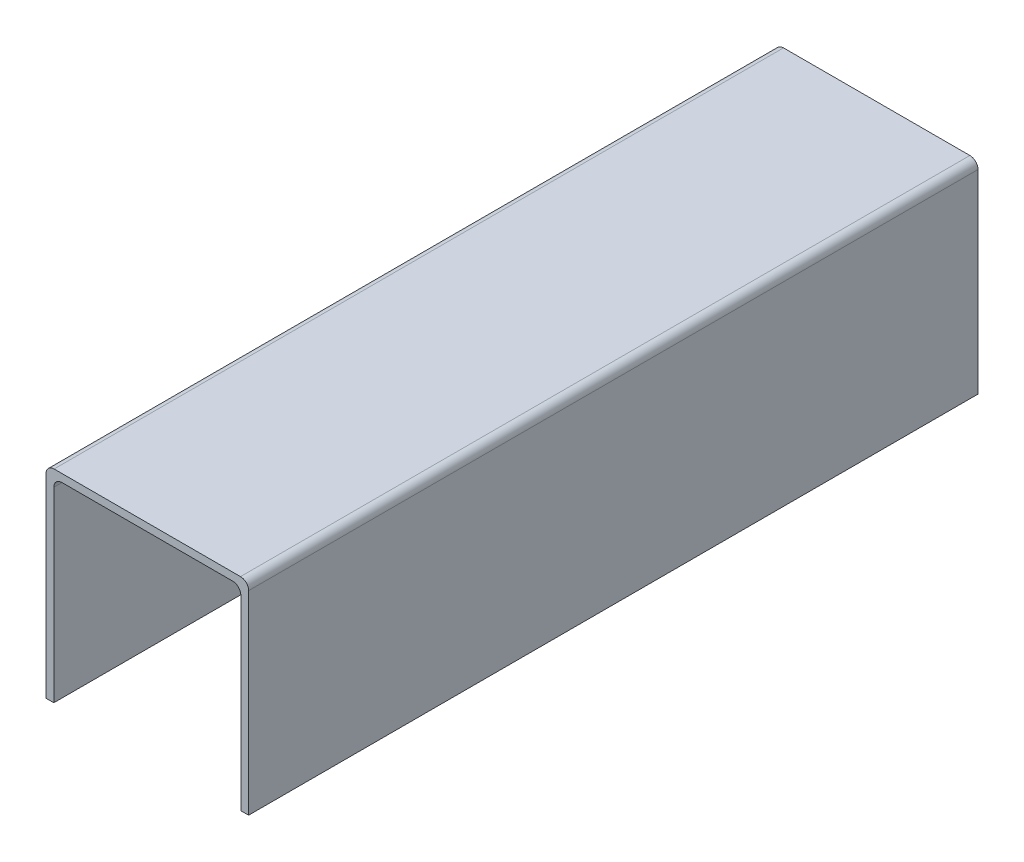
ISO-10303-21;
HEADER;
FILE_DESCRIPTION(('STEP AP214'),'2;1');
FILE_NAME('part.step','',(''),(''),'','','');
FILE_SCHEMA(('AUTOMOTIVE_DESIGN { 1 0 10303 214 1 1 1 1 }'));
ENDSEC;
DATA;
#1=APPLICATION_CONTEXT('core data for automotive mechanical design processes');
#2=APPLICATION_PROTOCOL_DEFINITION('international standard','automotive_design',2000,#1);
#3=PRODUCT_CONTEXT('',#1,'mechanical');
#4=PRODUCT('Part','Part','',(#3));
#5=PRODUCT_RELATED_PRODUCT_CATEGORY('part','',(#4));
#6=PRODUCT_DEFINITION_FORMATION('','',#4);
#7=PRODUCT_DEFINITION_CONTEXT('part definition',#1,'design');
#8=PRODUCT_DEFINITION('design','',#6,#7);
#9=PRODUCT_DEFINITION_SHAPE('','',#8);
#10=(LENGTH_UNIT() NAMED_UNIT(*) SI_UNIT(.MILLI.,.METRE.));
#11=(NAMED_UNIT(*) PLANE_ANGLE_UNIT() SI_UNIT($,.RADIAN.));
#12=(NAMED_UNIT(*) SI_UNIT($,.STERADIAN.) SOLID_ANGLE_UNIT());
#13=UNCERTAINTY_MEASURE_WITH_UNIT(LENGTH_MEASURE(1.E-05),#10,'distance_accuracy_value','');
#14=(GEOMETRIC_REPRESENTATION_CONTEXT(3) GLOBAL_UNCERTAINTY_ASSIGNED_CONTEXT((#13)) GLOBAL_UNIT_ASSIGNED_CONTEXT((#10,
#11,#12)) REPRESENTATION_CONTEXT('',''));
#15=CARTESIAN_POINT('',(0.,0.,0.));
#16=DIRECTION('',(0.,0.,1.));
#17=DIRECTION('',(1.,0.,0.));
#18=AXIS2_PLACEMENT_3D('',#15,#16,#17);
#19=CARTESIAN_POINT('',(1.92778,0.,180.));
#20=DIRECTION('',(0.,1.,0.));
#21=DIRECTION('',(-1.,0.,0.));
#22=AXIS2_PLACEMENT_3D('',#19,#20,#21);
#23=PLANE('',#22);
#24=DIRECTION('',(1.,0.,0.));
#25=VECTOR('',#24,1.);
#26=CARTESIAN_POINT('',(1.92778,0.,0.));
#27=LINE('',#26,#25);
#28=CARTESIAN_POINT('',(0.,0.,0.));
#29=VERTEX_POINT('',#28);
#30=CARTESIAN_POINT('',(1.92778,0.,0.));
#31=VERTEX_POINT('',#30);
#32=EDGE_CURVE('E152',#29,#31,#27,.T.);
#33=ORIENTED_EDGE('',*,*,#32,.T.);
#34=DIRECTION('',(0.,0.,-1.));
#35=VECTOR('',#34,1.);
#36=CARTESIAN_POINT('',(1.92778,0.,180.));
#37=LINE('',#36,#35);
#38=CARTESIAN_POINT('',(1.92778,0.,180.));
#39=VERTEX_POINT('',#38);
#40=EDGE_CURVE('E133',#39,#31,#37,.T.);
#41=ORIENTED_EDGE('',*,*,#40,.F.);
#42=DIRECTION('',(1.,0.,0.));
#43=VECTOR('',#42,1.);
#44=CARTESIAN_POINT('',(1.92778,0.,180.));
#45=LINE('',#44,#43);
#46=CARTESIAN_POINT('',(0.,0.,180.));
#47=VERTEX_POINT('',#46);
#48=EDGE_CURVE('E139',#47,#39,#45,.T.);
#49=ORIENTED_EDGE('',*,*,#48,.F.);
#50=DIRECTION('',(0.,0.,-1.));
#51=VECTOR('',#50,1.);
#52=CARTESIAN_POINT('',(0.,0.,180.));
#53=LINE('',#52,#51);
#54=EDGE_CURVE('E222',#47,#29,#53,.T.);
#55=ORIENTED_EDGE('',*,*,#54,.T.);
#56=EDGE_LOOP('',(#33,#41,#49,#55));
#57=FACE_BOUND('',#56,.T.);
#58=ADVANCED_FACE('F38',(#57),#23,.F.);
#59=CARTESIAN_POINT('',(1.92777999999999,48.07222,180.));
#60=DIRECTION('',(-1.,0.,0.));
#61=DIRECTION('',(0.,-1.,0.));
#62=AXIS2_PLACEMENT_3D('',#59,#60,#61);
#63=PLANE('',#62);
#64=DIRECTION('',(0.,1.,0.));
#65=VECTOR('',#64,1.);
#66=CARTESIAN_POINT('',(1.92777999999999,48.07222,0.));
#67=LINE('',#66,#65);
#68=CARTESIAN_POINT('',(1.92777999999999,46.07222,0.));
#69=VERTEX_POINT('',#68);
#70=EDGE_CURVE('E205',#31,#69,#67,.T.);
#71=ORIENTED_EDGE('',*,*,#70,.T.);
#72=DIRECTION('',(0.,0.,-1.));
#73=VECTOR('',#72,1.);
#74=CARTESIAN_POINT('',(1.92777999999999,46.07222,180.));
#75=LINE('',#74,#73);
#76=CARTESIAN_POINT('',(1.92777999999999,46.07222,180.));
#77=VERTEX_POINT('',#76);
#78=EDGE_CURVE('E136',#69,#77,#75,.F.);
#79=ORIENTED_EDGE('',*,*,#78,.T.);
#80=DIRECTION('',(0.,1.,0.));
#81=VECTOR('',#80,1.);
#82=CARTESIAN_POINT('',(1.92777999999999,48.07222,180.));
#83=LINE('',#82,#81);
#84=EDGE_CURVE('E128',#39,#77,#83,.T.);
#85=ORIENTED_EDGE('',*,*,#84,.F.);
#86=ORIENTED_EDGE('',*,*,#40,.T.);
#87=EDGE_LOOP('',(#71,#79,#85,#86));
#88=FACE_BOUND('',#87,.T.);
#89=ADVANCED_FACE('F131',(#88),#63,.F.);
#90=CARTESIAN_POINT('',(48.07222,48.07222,180.));
#91=DIRECTION('',(0.,1.,0.));
#92=DIRECTION('',(-1.,0.,0.));
#93=AXIS2_PLACEMENT_3D('',#90,#91,#92);
#94=PLANE('',#93);
#95=DIRECTION('',(1.,0.,0.));
#96=VECTOR('',#95,1.);
#97=CARTESIAN_POINT('',(48.07222,48.07222,180.));
#98=LINE('',#97,#96);
#99=CARTESIAN_POINT('',(3.92778,48.07222,180.));
#100=VERTEX_POINT('',#99);
#101=CARTESIAN_POINT('',(46.07222,48.07222,180.));
#102=VERTEX_POINT('',#101);
#103=EDGE_CURVE('E138',#100,#102,#98,.T.);
#104=ORIENTED_EDGE('',*,*,#103,.F.);
#105=DIRECTION('',(0.,0.,-1.));
#106=VECTOR('',#105,1.);
#107=CARTESIAN_POINT('',(3.92778,48.07222,0.));
#108=LINE('',#107,#106);
#109=CARTESIAN_POINT('',(3.92778,48.07222,0.));
#110=VERTEX_POINT('',#109);
#111=EDGE_CURVE('E179',#100,#110,#108,.T.);
#112=ORIENTED_EDGE('',*,*,#111,.T.);
#113=DIRECTION('',(1.,0.,0.));
#114=VECTOR('',#113,1.);
#115=CARTESIAN_POINT('',(48.07222,48.07222,0.));
#116=LINE('',#115,#114);
#117=CARTESIAN_POINT('',(46.07222,48.07222,0.));
#118=VERTEX_POINT('',#117);
#119=EDGE_CURVE('E195',#110,#118,#116,.T.);
#120=ORIENTED_EDGE('',*,*,#119,.T.);
#121=DIRECTION('',(0.,0.,-1.));
#122=VECTOR('',#121,1.);
#123=CARTESIAN_POINT('',(46.07222,48.07222,180.));
#124=LINE('',#123,#122);
#125=EDGE_CURVE('E177',#118,#102,#124,.F.);
#126=ORIENTED_EDGE('',*,*,#125,.T.);
#127=EDGE_LOOP('',(#104,#112,#120,#126));
#128=FACE_BOUND('',#127,.T.);
#129=ADVANCED_FACE('F203',(#128),#94,.F.);
#130=CARTESIAN_POINT('',(48.07222,0.,180.));
#131=DIRECTION('',(1.,0.,0.));
#132=DIRECTION('',(0.,0.,-1.));
#133=AXIS2_PLACEMENT_3D('',#130,#131,#132);
#134=PLANE('',#133);
#135=DIRECTION('',(0.,-1.,0.));
#136=VECTOR('',#135,1.);
#137=CARTESIAN_POINT('',(48.07222,0.,180.));
#138=LINE('',#137,#136);
#139=CARTESIAN_POINT('',(48.07222,46.07222,180.));
#140=VERTEX_POINT('',#139);
#141=CARTESIAN_POINT('',(48.07222,0.,180.));
#142=VERTEX_POINT('',#141);
#143=EDGE_CURVE('E210',#140,#142,#138,.T.);
#144=ORIENTED_EDGE('',*,*,#143,.F.);
#145=DIRECTION('',(0.,0.,-1.));
#146=VECTOR('',#145,1.);
#147=CARTESIAN_POINT('',(48.07222,46.07222,0.));
#148=LINE('',#147,#146);
#149=CARTESIAN_POINT('',(48.07222,46.07222,0.));
#150=VERTEX_POINT('',#149);
#151=EDGE_CURVE('E183',#140,#150,#148,.T.);
#152=ORIENTED_EDGE('',*,*,#151,.T.);
#153=DIRECTION('',(0.,-1.,0.));
#154=VECTOR('',#153,1.);
#155=CARTESIAN_POINT('',(48.07222,0.,0.));
#156=LINE('',#155,#154);
#157=CARTESIAN_POINT('',(48.07222,0.,0.));
#158=VERTEX_POINT('',#157);
#159=EDGE_CURVE('E197',#150,#158,#156,.T.);
#160=ORIENTED_EDGE('',*,*,#159,.T.);
#161=DIRECTION('',(0.,0.,-1.));
#162=VECTOR('',#161,1.);
#163=CARTESIAN_POINT('',(48.07222,0.,180.));
#164=LINE('',#163,#162);
#165=EDGE_CURVE('E154',#142,#158,#164,.T.);
#166=ORIENTED_EDGE('',*,*,#165,.F.);
#167=EDGE_LOOP('',(#144,#152,#160,#166));
#168=FACE_BOUND('',#167,.T.);
#169=ADVANCED_FACE('F208',(#168),#134,.F.);
#170=CARTESIAN_POINT('',(50.,0.,180.));
#171=DIRECTION('',(0.,1.,0.));
#172=DIRECTION('',(-1.,0.,0.));
#173=AXIS2_PLACEMENT_3D('',#170,#171,#172);
#174=PLANE('',#173);
#175=DIRECTION('',(1.,0.,0.));
#176=VECTOR('',#175,1.);
#177=CARTESIAN_POINT('',(50.,0.,0.));
#178=LINE('',#177,#176);
#179=CARTESIAN_POINT('',(50.,0.,0.));
#180=VERTEX_POINT('',#179);
#181=EDGE_CURVE('E226',#158,#180,#178,.T.);
#182=ORIENTED_EDGE('',*,*,#181,.T.);
#183=DIRECTION('',(0.,0.,-1.));
#184=VECTOR('',#183,1.);
#185=CARTESIAN_POINT('',(50.,0.,180.));
#186=LINE('',#185,#184);
#187=CARTESIAN_POINT('',(50.,0.,180.));
#188=VERTEX_POINT('',#187);
#189=EDGE_CURVE('E160',#188,#180,#186,.T.);
#190=ORIENTED_EDGE('',*,*,#189,.F.);
#191=DIRECTION('',(1.,0.,0.));
#192=VECTOR('',#191,1.);
#193=CARTESIAN_POINT('',(50.,0.,180.));
#194=LINE('',#193,#192);
#195=EDGE_CURVE('E212',#142,#188,#194,.T.);
#196=ORIENTED_EDGE('',*,*,#195,.F.);
#197=ORIENTED_EDGE('',*,*,#165,.T.);
#198=EDGE_LOOP('',(#182,#190,#196,#197));
#199=FACE_BOUND('',#198,.T.);
#200=ADVANCED_FACE('F286',(#199),#174,.F.);
#201=CARTESIAN_POINT('',(50.,50.,180.));
#202=DIRECTION('',(-1.,0.,0.));
#203=DIRECTION('',(0.,0.,1.));
#204=AXIS2_PLACEMENT_3D('',#201,#202,#203);
#205=PLANE('',#204);
#206=DIRECTION('',(0.,1.,0.));
#207=VECTOR('',#206,1.);
#208=CARTESIAN_POINT('',(50.,50.,0.));
#209=LINE('',#208,#207);
#210=CARTESIAN_POINT('',(50.,48.,0.));
#211=VERTEX_POINT('',#210);
#212=EDGE_CURVE('E228',#180,#211,#209,.T.);
#213=ORIENTED_EDGE('',*,*,#212,.T.);
#214=DIRECTION('',(0.,0.,-1.));
#215=VECTOR('',#214,1.);
#216=CARTESIAN_POINT('',(50.,48.,180.));
#217=LINE('',#216,#215);
#218=CARTESIAN_POINT('',(50.,48.,180.));
#219=VERTEX_POINT('',#218);
#220=EDGE_CURVE('E53',#211,#219,#217,.F.);
#221=ORIENTED_EDGE('',*,*,#220,.T.);
#222=DIRECTION('',(0.,1.,0.));
#223=VECTOR('',#222,1.);
#224=CARTESIAN_POINT('',(50.,50.,180.));
#225=LINE('',#224,#223);
#226=EDGE_CURVE('E214',#188,#219,#225,.T.);
#227=ORIENTED_EDGE('',*,*,#226,.F.);
#228=ORIENTED_EDGE('',*,*,#189,.T.);
#229=EDGE_LOOP('',(#213,#221,#227,#228));
#230=FACE_BOUND('',#229,.T.);
#231=ADVANCED_FACE('F237',(#230),#205,.F.);
#232=CARTESIAN_POINT('',(0.,50.,180.));
#233=DIRECTION('',(0.,-1.,0.));
#234=DIRECTION('',(0.,0.,-1.));
#235=AXIS2_PLACEMENT_3D('',#232,#233,#234);
#236=PLANE('',#235);
#237=DIRECTION('',(-1.,0.,0.));
#238=VECTOR('',#237,1.);
#239=CARTESIAN_POINT('',(0.,50.,0.));
#240=LINE('',#239,#238);
#241=CARTESIAN_POINT('',(48.,50.,0.));
#242=VERTEX_POINT('',#241);
#243=CARTESIAN_POINT('',(2.,50.,0.));
#244=VERTEX_POINT('',#243);
#245=EDGE_CURVE('E230',#242,#244,#240,.T.);
#246=ORIENTED_EDGE('',*,*,#245,.T.);
#247=DIRECTION('',(0.,0.,-1.));
#248=VECTOR('',#247,1.);
#249=CARTESIAN_POINT('',(2.,50.,180.));
#250=LINE('',#249,#248);
#251=CARTESIAN_POINT('',(2.,50.,180.));
#252=VERTEX_POINT('',#251);
#253=EDGE_CURVE('E170',#244,#252,#250,.F.);
#254=ORIENTED_EDGE('',*,*,#253,.T.);
#255=DIRECTION('',(-1.,0.,0.));
#256=VECTOR('',#255,1.);
#257=CARTESIAN_POINT('',(0.,50.,180.));
#258=LINE('',#257,#256);
#259=CARTESIAN_POINT('',(48.,50.,180.));
#260=VERTEX_POINT('',#259);
#261=EDGE_CURVE('E219',#260,#252,#258,.T.);
#262=ORIENTED_EDGE('',*,*,#261,.F.);
#263=DIRECTION('',(0.,0.,-1.));
#264=VECTOR('',#263,1.);
#265=CARTESIAN_POINT('',(48.,50.,180.));
#266=LINE('',#265,#264);
#267=EDGE_CURVE('E167',#260,#242,#266,.T.);
#268=ORIENTED_EDGE('',*,*,#267,.T.);
#269=EDGE_LOOP('',(#246,#254,#262,#268));
#270=FACE_BOUND('',#269,.T.);
#271=ADVANCED_FACE('F246',(#270),#236,.F.);
#272=CARTESIAN_POINT('',(0.,0.,180.));
#273=DIRECTION('',(1.,0.,0.));
#274=DIRECTION('',(0.,0.,-1.));
#275=AXIS2_PLACEMENT_3D('',#272,#273,#274);
#276=PLANE('',#275);
#277=DIRECTION('',(0.,-1.,0.));
#278=VECTOR('',#277,1.);
#279=CARTESIAN_POINT('',(0.,0.,180.));
#280=LINE('',#279,#278);
#281=CARTESIAN_POINT('',(0.,48.,180.));
#282=VERTEX_POINT('',#281);
#283=EDGE_CURVE('E145',#282,#47,#280,.T.);
#284=ORIENTED_EDGE('',*,*,#283,.F.);
#285=DIRECTION('',(0.,0.,-1.));
#286=VECTOR('',#285,1.);
#287=CARTESIAN_POINT('',(0.,48.,180.));
#288=LINE('',#287,#286);
#289=CARTESIAN_POINT('',(0.,48.,0.));
#290=VERTEX_POINT('',#289);
#291=EDGE_CURVE('E153',#282,#290,#288,.T.);
#292=ORIENTED_EDGE('',*,*,#291,.T.);
#293=DIRECTION('',(0.,-1.,0.));
#294=VECTOR('',#293,1.);
#295=CARTESIAN_POINT('',(0.,0.,0.));
#296=LINE('',#295,#294);
#297=EDGE_CURVE('E149',#290,#29,#296,.T.);
#298=ORIENTED_EDGE('',*,*,#297,.T.);
#299=ORIENTED_EDGE('',*,*,#54,.F.);
#300=EDGE_LOOP('',(#284,#292,#298,#299));
#301=FACE_BOUND('',#300,.T.);
#302=ADVANCED_FACE('F253',(#301),#276,.F.);
#303=CARTESIAN_POINT('',(0.,0.,180.));
#304=DIRECTION('',(0.,0.,-1.));
#305=DIRECTION('',(-1.,0.,0.));
#306=AXIS2_PLACEMENT_3D('',#303,#304,#305);
#307=PLANE('',#306);
#308=ORIENTED_EDGE('',*,*,#261,.T.);
#309=CARTESIAN_POINT('',(2.,48.,180.));
#310=DIRECTION('',(0.,0.,-1.));
#311=DIRECTION('',(-1.,0.,0.));
#312=AXIS2_PLACEMENT_3D('',#309,#310,#311);
#313=CIRCLE('',#312,2.);
#314=EDGE_CURVE('E174',#252,#282,#313,.F.);
#315=ORIENTED_EDGE('',*,*,#314,.T.);
#316=ORIENTED_EDGE('',*,*,#283,.T.);
#317=ORIENTED_EDGE('',*,*,#48,.T.);
#318=ORIENTED_EDGE('',*,*,#84,.T.);
#319=CARTESIAN_POINT('',(3.92778,46.07222,180.));
#320=DIRECTION('',(0.,0.,-1.));
#321=DIRECTION('',(-1.,0.,0.));
#322=AXIS2_PLACEMENT_3D('',#319,#320,#321);
#323=CIRCLE('',#322,2.);
#324=EDGE_CURVE('E188',#77,#100,#323,.T.);
#325=ORIENTED_EDGE('',*,*,#324,.T.);
#326=ORIENTED_EDGE('',*,*,#103,.T.);
#327=CARTESIAN_POINT('',(46.07222,46.07222,180.));
#328=DIRECTION('',(0.,0.,-1.));
#329=DIRECTION('',(-1.,0.,0.));
#330=AXIS2_PLACEMENT_3D('',#327,#328,#329);
#331=CIRCLE('',#330,2.);
#332=EDGE_CURVE('E11',#102,#140,#331,.T.);
#333=ORIENTED_EDGE('',*,*,#332,.T.);
#334=ORIENTED_EDGE('',*,*,#143,.T.);
#335=ORIENTED_EDGE('',*,*,#195,.T.);
#336=ORIENTED_EDGE('',*,*,#226,.T.);
#337=CARTESIAN_POINT('',(48.,48.,180.));
#338=DIRECTION('',(0.,0.,-1.));
#339=DIRECTION('',(-1.,0.,0.));
#340=AXIS2_PLACEMENT_3D('',#337,#338,#339);
#341=CIRCLE('',#340,2.);
#342=EDGE_CURVE('E172',#219,#260,#341,.F.);
#343=ORIENTED_EDGE('',*,*,#342,.T.);
#344=EDGE_LOOP('',(#308,#315,#316,#317,#318,#325,#326,#333,#334,#335,#336,#343));
#345=FACE_BOUND('',#344,.T.);
#346=ADVANCED_FACE('F143',(#345),#307,.F.);
#347=CARTESIAN_POINT('',(0.,0.,0.));
#348=DIRECTION('',(0.,0.,-1.));
#349=DIRECTION('',(-1.,0.,0.));
#350=AXIS2_PLACEMENT_3D('',#347,#348,#349);
#351=PLANE('',#350);
#352=ORIENTED_EDGE('',*,*,#297,.F.);
#353=CARTESIAN_POINT('',(2.,48.,0.));
#354=DIRECTION('',(0.,0.,-1.));
#355=DIRECTION('',(-1.,0.,0.));
#356=AXIS2_PLACEMENT_3D('',#353,#354,#355);
#357=CIRCLE('',#356,2.);
#358=EDGE_CURVE('E165',#290,#244,#357,.T.);
#359=ORIENTED_EDGE('',*,*,#358,.T.);
#360=ORIENTED_EDGE('',*,*,#245,.F.);
#361=CARTESIAN_POINT('',(48.,48.,0.));
#362=DIRECTION('',(0.,0.,-1.));
#363=DIRECTION('',(-1.,0.,0.));
#364=AXIS2_PLACEMENT_3D('',#361,#362,#363);
#365=CIRCLE('',#364,2.);
#366=EDGE_CURVE('E157',#242,#211,#365,.T.);
#367=ORIENTED_EDGE('',*,*,#366,.T.);
#368=ORIENTED_EDGE('',*,*,#212,.F.);
#369=ORIENTED_EDGE('',*,*,#181,.F.);
#370=ORIENTED_EDGE('',*,*,#159,.F.);
#371=CARTESIAN_POINT('',(46.07222,46.07222,0.));
#372=DIRECTION('',(0.,0.,-1.));
#373=DIRECTION('',(-1.,0.,0.));
#374=AXIS2_PLACEMENT_3D('',#371,#372,#373);
#375=CIRCLE('',#374,2.);
#376=EDGE_CURVE('E46',#150,#118,#375,.F.);
#377=ORIENTED_EDGE('',*,*,#376,.T.);
#378=ORIENTED_EDGE('',*,*,#119,.F.);
#379=CARTESIAN_POINT('',(3.92778,46.07222,0.));
#380=DIRECTION('',(0.,0.,-1.));
#381=DIRECTION('',(-1.,0.,0.));
#382=AXIS2_PLACEMENT_3D('',#379,#380,#381);
#383=CIRCLE('',#382,2.);
#384=EDGE_CURVE('E186',#110,#69,#383,.F.);
#385=ORIENTED_EDGE('',*,*,#384,.T.);
#386=ORIENTED_EDGE('',*,*,#70,.F.);
#387=ORIENTED_EDGE('',*,*,#32,.F.);
#388=EDGE_LOOP('',(#352,#359,#360,#367,#368,#369,#370,#377,#378,#385,#386,#387));
#389=FACE_BOUND('',#388,.T.);
#390=ADVANCED_FACE('F194',(#389),#351,.T.);
#391=CARTESIAN_POINT('',(2.,48.,180.));
#392=DIRECTION('',(0.,0.,-1.));
#393=DIRECTION('',(-1.,0.,0.));
#394=AXIS2_PLACEMENT_3D('',#391,#392,#393);
#395=CYLINDRICAL_SURFACE('',#394,2.);
#396=ORIENTED_EDGE('',*,*,#314,.F.);
#397=ORIENTED_EDGE('',*,*,#253,.F.);
#398=ORIENTED_EDGE('',*,*,#358,.F.);
#399=ORIENTED_EDGE('',*,*,#291,.F.);
#400=EDGE_LOOP('',(#396,#397,#398,#399));
#401=FACE_BOUND('',#400,.T.);
#402=ADVANCED_FACE('F251',(#401),#395,.T.);
#403=CARTESIAN_POINT('',(48.,48.,180.));
#404=DIRECTION('',(0.,0.,-1.));
#405=DIRECTION('',(-1.,0.,0.));
#406=AXIS2_PLACEMENT_3D('',#403,#404,#405);
#407=CYLINDRICAL_SURFACE('',#406,2.);
#408=ORIENTED_EDGE('',*,*,#342,.F.);
#409=ORIENTED_EDGE('',*,*,#220,.F.);
#410=ORIENTED_EDGE('',*,*,#366,.F.);
#411=ORIENTED_EDGE('',*,*,#267,.F.);
#412=EDGE_LOOP('',(#408,#409,#410,#411));
#413=FACE_BOUND('',#412,.T.);
#414=ADVANCED_FACE('F243',(#413),#407,.T.);
#415=CARTESIAN_POINT('',(3.92778,46.07222,180.));
#416=DIRECTION('',(0.,0.,1.));
#417=DIRECTION('',(1.,0.,0.));
#418=AXIS2_PLACEMENT_3D('',#415,#416,#417);
#419=CYLINDRICAL_SURFACE('',#418,2.);
#420=ORIENTED_EDGE('',*,*,#324,.F.);
#421=ORIENTED_EDGE('',*,*,#78,.F.);
#422=ORIENTED_EDGE('',*,*,#384,.F.);
#423=ORIENTED_EDGE('',*,*,#111,.F.);
#424=EDGE_LOOP('',(#420,#421,#422,#423));
#425=FACE_BOUND('',#424,.T.);
#426=ADVANCED_FACE('F255',(#425),#419,.F.);
#427=CARTESIAN_POINT('',(46.07222,46.07222,180.));
#428=DIRECTION('',(0.,0.,1.));
#429=DIRECTION('',(1.,0.,0.));
#430=AXIS2_PLACEMENT_3D('',#427,#428,#429);
#431=CYLINDRICAL_SURFACE('',#430,2.);
#432=ORIENTED_EDGE('',*,*,#332,.F.);
#433=ORIENTED_EDGE('',*,*,#125,.F.);
#434=ORIENTED_EDGE('',*,*,#376,.F.);
#435=ORIENTED_EDGE('',*,*,#151,.F.);
#436=EDGE_LOOP('',(#432,#433,#434,#435));
#437=FACE_BOUND('',#436,.T.);
#438=ADVANCED_FACE('F40',(#437),#431,.F.);
#439=CLOSED_SHELL('',(#58,#89,#129,#169,#200,#231,#271,#302,#346,#390,#402,#414,#426,#438));
#440=MANIFOLD_SOLID_BREP('B2',#439);
#441=ADVANCED_BREP_SHAPE_REPRESENTATION('',(#18,#440),#14);
#442=SHAPE_DEFINITION_REPRESENTATION(#9,#441);
ENDSEC;
END-ISO-10303-21;
